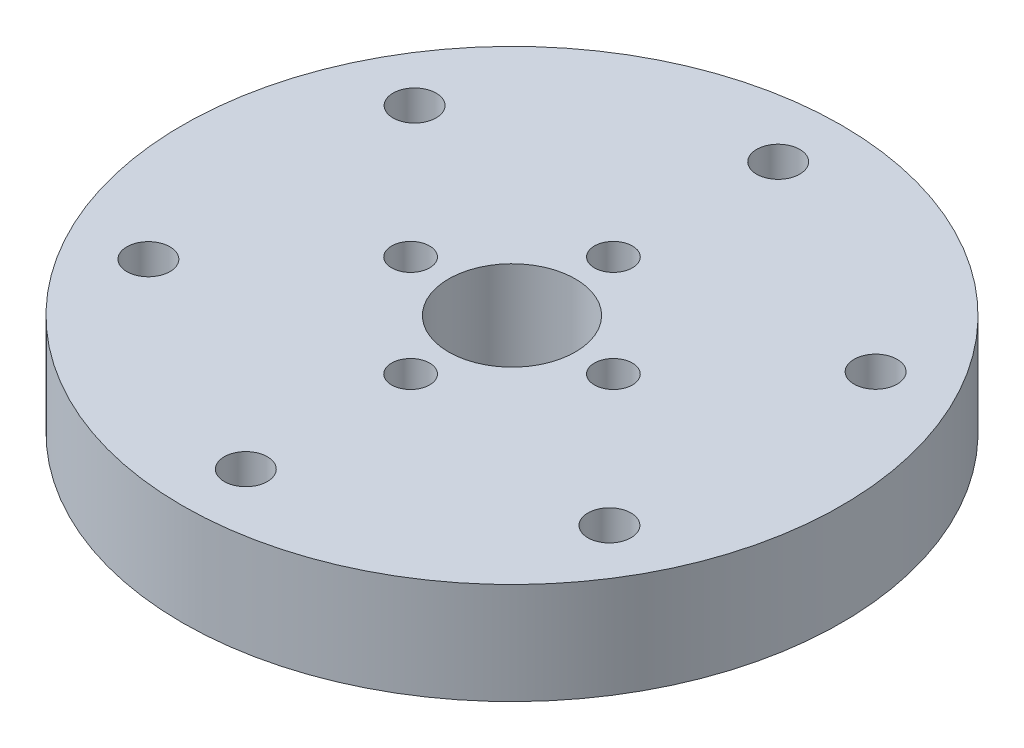
ISO-10303-21;
HEADER;
FILE_DESCRIPTION(('STEP AP214'),'2;1');
FILE_NAME('part.step','',(''),(''),'','','');
FILE_SCHEMA(('AUTOMOTIVE_DESIGN { 1 0 10303 214 1 1 1 1 }'));
ENDSEC;
DATA;
#1=APPLICATION_CONTEXT('core data for automotive mechanical design processes');
#2=APPLICATION_PROTOCOL_DEFINITION('international standard','automotive_design',2000,#1);
#3=PRODUCT_CONTEXT('',#1,'mechanical');
#4=PRODUCT('Part','Part','',(#3));
#5=PRODUCT_RELATED_PRODUCT_CATEGORY('part','',(#4));
#6=PRODUCT_DEFINITION_FORMATION('','',#4);
#7=PRODUCT_DEFINITION_CONTEXT('part definition',#1,'design');
#8=PRODUCT_DEFINITION('design','',#6,#7);
#9=PRODUCT_DEFINITION_SHAPE('','',#8);
#10=(LENGTH_UNIT() NAMED_UNIT(*) SI_UNIT(.MILLI.,.METRE.));
#11=(NAMED_UNIT(*) PLANE_ANGLE_UNIT() SI_UNIT($,.RADIAN.));
#12=(NAMED_UNIT(*) SI_UNIT($,.STERADIAN.) SOLID_ANGLE_UNIT());
#13=UNCERTAINTY_MEASURE_WITH_UNIT(LENGTH_MEASURE(1.E-05),#10,'distance_accuracy_value','');
#14=(GEOMETRIC_REPRESENTATION_CONTEXT(3) GLOBAL_UNCERTAINTY_ASSIGNED_CONTEXT((#13)) GLOBAL_UNIT_ASSIGNED_CONTEXT((#10,
#11,#12)) REPRESENTATION_CONTEXT('',''));
#15=CARTESIAN_POINT('',(0.,0.,0.));
#16=DIRECTION('',(0.,0.,1.));
#17=DIRECTION('',(1.,0.,0.));
#18=AXIS2_PLACEMENT_3D('',#15,#16,#17);
#19=CARTESIAN_POINT('',(0.,0.,0.));
#20=DIRECTION('',(0.,1.,0.));
#21=DIRECTION('',(0.,0.,1.));
#22=AXIS2_PLACEMENT_3D('',#19,#20,#21);
#23=PLANE('',#22);
#24=CARTESIAN_POINT('',(-18.1865334794731,0.,-10.5000000000002));
#25=DIRECTION('',(0.,1.,0.));
#26=DIRECTION('',(0.,0.,1.));
#27=AXIS2_PLACEMENT_3D('',#24,#25,#26);
#28=CIRCLE('',#27,1.7);
#29=CARTESIAN_POINT('',(-18.1865334794731,0.,-8.80000000000021));
#30=VERTEX_POINT('',#29);
#31=EDGE_CURVE('E121',#30,#30,#28,.T.);
#32=ORIENTED_EDGE('',*,*,#31,.T.);
#33=EDGE_LOOP('',(#32));
#34=FACE_BOUND('',#33,.T.);
#35=CARTESIAN_POINT('',(-18.1865334794731,0.,-10.5000000000002));
#36=DIRECTION('',(0.,1.,0.));
#37=DIRECTION('',(0.,0.,1.));
#38=AXIS2_PLACEMENT_3D('',#35,#36,#37);
#39=CIRCLE('',#38,3.25);
#40=CARTESIAN_POINT('',(-18.1865334794731,0.,-7.25000000000021));
#41=VERTEX_POINT('',#40);
#42=EDGE_CURVE('E11',#41,#41,#39,.T.);
#43=ORIENTED_EDGE('',*,*,#42,.F.);
#44=EDGE_LOOP('',(#43));
#45=FACE_BOUND('',#44,.T.);
#46=ADVANCED_FACE('F79',(#34,#45),#23,.F.);
#47=CARTESIAN_POINT('',(-18.1865334794733,0.,10.4999999999998));
#48=DIRECTION('',(0.,1.,0.));
#49=DIRECTION('',(0.,0.,1.));
#50=AXIS2_PLACEMENT_3D('',#47,#48,#49);
#51=CIRCLE('',#50,1.7);
#52=CARTESIAN_POINT('',(-18.1865334794733,0.,12.1999999999998));
#53=VERTEX_POINT('',#52);
#54=EDGE_CURVE('E165',#53,#53,#51,.T.);
#55=ORIENTED_EDGE('',*,*,#54,.T.);
#56=EDGE_LOOP('',(#55));
#57=FACE_BOUND('',#56,.T.);
#58=CARTESIAN_POINT('',(-18.1865334794733,0.,10.4999999999998));
#59=DIRECTION('',(0.,1.,0.));
#60=DIRECTION('',(0.,0.,1.));
#61=AXIS2_PLACEMENT_3D('',#58,#59,#60);
#62=CIRCLE('',#61,3.25);
#63=CARTESIAN_POINT('',(-18.1865334794733,0.,13.7499999999998));
#64=VERTEX_POINT('',#63);
#65=EDGE_CURVE('E88',#64,#64,#62,.T.);
#66=ORIENTED_EDGE('',*,*,#65,.F.);
#67=EDGE_LOOP('',(#66));
#68=FACE_BOUND('',#67,.T.);
#69=ADVANCED_FACE('F255',(#57,#68),#23,.F.);
#70=CARTESIAN_POINT('',(-1.46642216231412E-13,0.,21.));
#71=DIRECTION('',(0.,1.,0.));
#72=DIRECTION('',(0.,0.,1.));
#73=AXIS2_PLACEMENT_3D('',#70,#71,#72);
#74=CIRCLE('',#73,1.7);
#75=CARTESIAN_POINT('',(-1.46642216231412E-13,0.,22.7));
#76=VERTEX_POINT('',#75);
#77=EDGE_CURVE('E160',#76,#76,#74,.T.);
#78=ORIENTED_EDGE('',*,*,#77,.T.);
#79=EDGE_LOOP('',(#78));
#80=FACE_BOUND('',#79,.T.);
#81=CARTESIAN_POINT('',(-1.46642216231412E-13,0.,21.));
#82=DIRECTION('',(0.,1.,0.));
#83=DIRECTION('',(0.,0.,1.));
#84=AXIS2_PLACEMENT_3D('',#81,#82,#83);
#85=CIRCLE('',#84,3.25);
#86=CARTESIAN_POINT('',(-1.46642216231412E-13,0.,24.25));
#87=VERTEX_POINT('',#86);
#88=EDGE_CURVE('E94',#87,#87,#85,.T.);
#89=ORIENTED_EDGE('',*,*,#88,.F.);
#90=EDGE_LOOP('',(#89));
#91=FACE_BOUND('',#90,.T.);
#92=ADVANCED_FACE('F263',(#80,#91),#23,.F.);
#93=CARTESIAN_POINT('',(18.1865334794732,0.,10.5000000000001));
#94=DIRECTION('',(0.,1.,0.));
#95=DIRECTION('',(0.,0.,1.));
#96=AXIS2_PLACEMENT_3D('',#93,#94,#95);
#97=CIRCLE('',#96,1.7);
#98=CARTESIAN_POINT('',(18.1865334794732,0.,12.2000000000001));
#99=VERTEX_POINT('',#98);
#100=EDGE_CURVE('E156',#99,#99,#97,.T.);
#101=ORIENTED_EDGE('',*,*,#100,.T.);
#102=EDGE_LOOP('',(#101));
#103=FACE_BOUND('',#102,.T.);
#104=CARTESIAN_POINT('',(18.1865334794732,0.,10.5000000000001));
#105=DIRECTION('',(0.,1.,0.));
#106=DIRECTION('',(0.,0.,1.));
#107=AXIS2_PLACEMENT_3D('',#104,#105,#106);
#108=CIRCLE('',#107,3.25);
#109=CARTESIAN_POINT('',(18.1865334794732,0.,13.7500000000001));
#110=VERTEX_POINT('',#109);
#111=EDGE_CURVE('E103',#110,#110,#108,.T.);
#112=ORIENTED_EDGE('',*,*,#111,.F.);
#113=EDGE_LOOP('',(#112));
#114=FACE_BOUND('',#113,.T.);
#115=ADVANCED_FACE('F277',(#103,#114),#23,.F.);
#116=CARTESIAN_POINT('',(18.1865334794732,0.,-10.5));
#117=DIRECTION('',(0.,1.,0.));
#118=DIRECTION('',(0.,0.,1.));
#119=AXIS2_PLACEMENT_3D('',#116,#117,#118);
#120=CIRCLE('',#119,1.7);
#121=CARTESIAN_POINT('',(18.1865334794732,0.,-8.79999999999995));
#122=VERTEX_POINT('',#121);
#123=EDGE_CURVE('E175',#122,#122,#120,.T.);
#124=ORIENTED_EDGE('',*,*,#123,.T.);
#125=EDGE_LOOP('',(#124));
#126=FACE_BOUND('',#125,.T.);
#127=CARTESIAN_POINT('',(18.1865334794732,0.,-10.5));
#128=DIRECTION('',(0.,1.,0.));
#129=DIRECTION('',(0.,0.,1.));
#130=AXIS2_PLACEMENT_3D('',#127,#128,#129);
#131=CIRCLE('',#130,3.25);
#132=CARTESIAN_POINT('',(18.1865334794732,0.,-7.24999999999995));
#133=VERTEX_POINT('',#132);
#134=EDGE_CURVE('E107',#133,#133,#131,.T.);
#135=ORIENTED_EDGE('',*,*,#134,.F.);
#136=EDGE_LOOP('',(#135));
#137=FACE_BOUND('',#136,.T.);
#138=ADVANCED_FACE('F269',(#126,#137),#23,.F.);
#139=CARTESIAN_POINT('',(0.,0.,-21.));
#140=DIRECTION('',(0.,1.,0.));
#141=DIRECTION('',(0.,0.,1.));
#142=AXIS2_PLACEMENT_3D('',#139,#140,#141);
#143=CIRCLE('',#142,1.7);
#144=CARTESIAN_POINT('',(0.,0.,-19.3));
#145=VERTEX_POINT('',#144);
#146=EDGE_CURVE('E83',#145,#145,#143,.T.);
#147=ORIENTED_EDGE('',*,*,#146,.T.);
#148=EDGE_LOOP('',(#147));
#149=FACE_BOUND('',#148,.T.);
#150=CARTESIAN_POINT('',(0.,0.,-21.));
#151=DIRECTION('',(0.,1.,0.));
#152=DIRECTION('',(0.,0.,1.));
#153=AXIS2_PLACEMENT_3D('',#150,#151,#152);
#154=CIRCLE('',#153,3.25);
#155=CARTESIAN_POINT('',(0.,0.,-17.75));
#156=VERTEX_POINT('',#155);
#157=EDGE_CURVE('E111',#156,#156,#154,.T.);
#158=ORIENTED_EDGE('',*,*,#157,.F.);
#159=EDGE_LOOP('',(#158));
#160=FACE_BOUND('',#159,.T.);
#161=ADVANCED_FACE('F258',(#149,#160),#23,.F.);
#162=CARTESIAN_POINT('',(-18.1865334794731,4.7,-10.5000000000002));
#163=DIRECTION('',(0.,-1.,0.));
#164=DIRECTION('',(0.,0.,-1.));
#165=AXIS2_PLACEMENT_3D('',#162,#163,#164);
#166=CYLINDRICAL_SURFACE('',#165,1.7);
#167=CARTESIAN_POINT('',(-18.1865334794731,4.7,-10.5000000000002));
#168=DIRECTION('',(0.,1.,0.));
#169=DIRECTION('',(0.,0.,1.));
#170=AXIS2_PLACEMENT_3D('',#167,#168,#169);
#171=CIRCLE('',#170,1.7);
#172=CARTESIAN_POINT('',(-18.1865334794731,4.7,-8.80000000000021));
#173=VERTEX_POINT('',#172);
#174=EDGE_CURVE('E115',#173,#173,#171,.T.);
#175=ORIENTED_EDGE('',*,*,#174,.T.);
#176=EDGE_LOOP('',(#175));
#177=FACE_BOUND('',#176,.T.);
#178=ORIENTED_EDGE('',*,*,#31,.F.);
#179=EDGE_LOOP('',(#178));
#180=FACE_BOUND('',#179,.T.);
#181=ADVANCED_FACE('F268',(#177,#180),#166,.F.);
#182=CARTESIAN_POINT('',(-18.1865334794733,4.7,10.4999999999998));
#183=DIRECTION('',(0.,-1.,0.));
#184=DIRECTION('',(0.,0.,-1.));
#185=AXIS2_PLACEMENT_3D('',#182,#183,#184);
#186=CYLINDRICAL_SURFACE('',#185,1.7);
#187=CARTESIAN_POINT('',(-18.1865334794733,4.7,10.4999999999998));
#188=DIRECTION('',(0.,1.,0.));
#189=DIRECTION('',(0.,0.,1.));
#190=AXIS2_PLACEMENT_3D('',#187,#188,#189);
#191=CIRCLE('',#190,1.7);
#192=CARTESIAN_POINT('',(-18.1865334794733,4.7,12.1999999999998));
#193=VERTEX_POINT('',#192);
#194=EDGE_CURVE('E149',#193,#193,#191,.T.);
#195=ORIENTED_EDGE('',*,*,#194,.T.);
#196=EDGE_LOOP('',(#195));
#197=FACE_BOUND('',#196,.T.);
#198=ORIENTED_EDGE('',*,*,#54,.F.);
#199=EDGE_LOOP('',(#198));
#200=FACE_BOUND('',#199,.T.);
#201=ADVANCED_FACE('F275',(#197,#200),#186,.F.);
#202=CARTESIAN_POINT('',(-1.46642216231412E-13,4.7,21.));
#203=DIRECTION('',(0.,-1.,0.));
#204=DIRECTION('',(0.,0.,-1.));
#205=AXIS2_PLACEMENT_3D('',#202,#203,#204);
#206=CYLINDRICAL_SURFACE('',#205,1.7);
#207=CARTESIAN_POINT('',(-1.46642216231412E-13,4.7,21.));
#208=DIRECTION('',(0.,1.,0.));
#209=DIRECTION('',(0.,0.,1.));
#210=AXIS2_PLACEMENT_3D('',#207,#208,#209);
#211=CIRCLE('',#210,1.7);
#212=CARTESIAN_POINT('',(-1.46642216231412E-13,4.7,22.7));
#213=VERTEX_POINT('',#212);
#214=EDGE_CURVE('E145',#213,#213,#211,.T.);
#215=ORIENTED_EDGE('',*,*,#214,.T.);
#216=EDGE_LOOP('',(#215));
#217=FACE_BOUND('',#216,.T.);
#218=ORIENTED_EDGE('',*,*,#77,.F.);
#219=EDGE_LOOP('',(#218));
#220=FACE_BOUND('',#219,.T.);
#221=ADVANCED_FACE('F317',(#217,#220),#206,.F.);
#222=CARTESIAN_POINT('',(18.1865334794732,4.7,10.5000000000001));
#223=DIRECTION('',(0.,-1.,0.));
#224=DIRECTION('',(0.,0.,-1.));
#225=AXIS2_PLACEMENT_3D('',#222,#223,#224);
#226=CYLINDRICAL_SURFACE('',#225,1.7);
#227=CARTESIAN_POINT('',(18.1865334794732,4.7,10.5000000000001));
#228=DIRECTION('',(0.,1.,0.));
#229=DIRECTION('',(0.,0.,1.));
#230=AXIS2_PLACEMENT_3D('',#227,#228,#229);
#231=CIRCLE('',#230,1.7);
#232=CARTESIAN_POINT('',(18.1865334794732,4.7,12.2000000000001));
#233=VERTEX_POINT('',#232);
#234=EDGE_CURVE('E141',#233,#233,#231,.T.);
#235=ORIENTED_EDGE('',*,*,#234,.T.);
#236=EDGE_LOOP('',(#235));
#237=FACE_BOUND('',#236,.T.);
#238=ORIENTED_EDGE('',*,*,#100,.F.);
#239=EDGE_LOOP('',(#238));
#240=FACE_BOUND('',#239,.T.);
#241=ADVANCED_FACE('F319',(#237,#240),#226,.F.);
#242=CARTESIAN_POINT('',(0.,4.7,0.));
#243=DIRECTION('',(0.,-1.,0.));
#244=DIRECTION('',(0.,0.,-1.));
#245=AXIS2_PLACEMENT_3D('',#242,#243,#244);
#246=CYLINDRICAL_SURFACE('',#245,26.);
#247=CARTESIAN_POINT('',(0.,4.7,0.));
#248=DIRECTION('',(0.,1.,0.));
#249=DIRECTION('',(0.,0.,1.));
#250=AXIS2_PLACEMENT_3D('',#247,#248,#249);
#251=CIRCLE('',#250,26.);
#252=CARTESIAN_POINT('',(0.,4.7,26.));
#253=VERTEX_POINT('',#252);
#254=EDGE_CURVE('E137',#253,#253,#251,.T.);
#255=ORIENTED_EDGE('',*,*,#254,.F.);
#256=EDGE_LOOP('',(#255));
#257=FACE_BOUND('',#256,.T.);
#258=CARTESIAN_POINT('',(0.,-3.3,0.));
#259=DIRECTION('',(0.,1.,0.));
#260=DIRECTION('',(0.,0.,1.));
#261=AXIS2_PLACEMENT_3D('',#258,#259,#260);
#262=CIRCLE('',#261,26.);
#263=CARTESIAN_POINT('',(0.,-3.3,26.));
#264=VERTEX_POINT('',#263);
#265=EDGE_CURVE('E97',#264,#264,#262,.T.);
#266=ORIENTED_EDGE('',*,*,#265,.T.);
#267=EDGE_LOOP('',(#266));
#268=FACE_BOUND('',#267,.T.);
#269=ADVANCED_FACE('F326',(#257,#268),#246,.T.);
#270=CARTESIAN_POINT('',(0.,4.7,0.));
#271=DIRECTION('',(0.,-1.,0.));
#272=DIRECTION('',(0.,0.,-1.));
#273=AXIS2_PLACEMENT_3D('',#270,#271,#272);
#274=CYLINDRICAL_SURFACE('',#273,5.);
#275=CARTESIAN_POINT('',(0.,4.7,0.));
#276=DIRECTION('',(0.,1.,0.));
#277=DIRECTION('',(0.,0.,1.));
#278=AXIS2_PLACEMENT_3D('',#275,#276,#277);
#279=CIRCLE('',#278,5.);
#280=CARTESIAN_POINT('',(0.,4.7,5.));
#281=VERTEX_POINT('',#280);
#282=EDGE_CURVE('E133',#281,#281,#279,.T.);
#283=ORIENTED_EDGE('',*,*,#282,.T.);
#284=EDGE_LOOP('',(#283));
#285=FACE_BOUND('',#284,.T.);
#286=CARTESIAN_POINT('',(0.,-3.3,0.));
#287=DIRECTION('',(0.,1.,0.));
#288=DIRECTION('',(0.,0.,1.));
#289=AXIS2_PLACEMENT_3D('',#286,#287,#288);
#290=CIRCLE('',#289,5.);
#291=CARTESIAN_POINT('',(0.,-3.3,5.));
#292=VERTEX_POINT('',#291);
#293=EDGE_CURVE('E189',#292,#292,#290,.T.);
#294=ORIENTED_EDGE('',*,*,#293,.F.);
#295=EDGE_LOOP('',(#294));
#296=FACE_BOUND('',#295,.T.);
#297=ADVANCED_FACE('F333',(#285,#296),#274,.F.);
#298=CARTESIAN_POINT('',(0.,4.7,8.));
#299=DIRECTION('',(0.,-1.,0.));
#300=DIRECTION('',(0.,0.,-1.));
#301=AXIS2_PLACEMENT_3D('',#298,#299,#300);
#302=CYLINDRICAL_SURFACE('',#301,1.5);
#303=CARTESIAN_POINT('',(0.,4.7,8.));
#304=DIRECTION('',(0.,1.,0.));
#305=DIRECTION('',(0.,0.,1.));
#306=AXIS2_PLACEMENT_3D('',#303,#304,#305);
#307=CIRCLE('',#306,1.5);
#308=CARTESIAN_POINT('',(0.,4.7,9.5));
#309=VERTEX_POINT('',#308);
#310=EDGE_CURVE('E129',#309,#309,#307,.T.);
#311=ORIENTED_EDGE('',*,*,#310,.T.);
#312=EDGE_LOOP('',(#311));
#313=FACE_BOUND('',#312,.T.);
#314=CARTESIAN_POINT('',(0.,-3.3,8.));
#315=DIRECTION('',(0.,1.,0.));
#316=DIRECTION('',(0.,0.,1.));
#317=AXIS2_PLACEMENT_3D('',#314,#315,#316);
#318=CIRCLE('',#317,1.5);
#319=CARTESIAN_POINT('',(0.,-3.3,9.5));
#320=VERTEX_POINT('',#319);
#321=EDGE_CURVE('E194',#320,#320,#318,.T.);
#322=ORIENTED_EDGE('',*,*,#321,.F.);
#323=EDGE_LOOP('',(#322));
#324=FACE_BOUND('',#323,.T.);
#325=ADVANCED_FACE('F337',(#313,#324),#302,.F.);
#326=CARTESIAN_POINT('',(-8.,4.7,0.));
#327=DIRECTION('',(0.,-1.,0.));
#328=DIRECTION('',(0.,0.,-1.));
#329=AXIS2_PLACEMENT_3D('',#326,#327,#328);
#330=CYLINDRICAL_SURFACE('',#329,1.5);
#331=CARTESIAN_POINT('',(-8.,4.7,0.));
#332=DIRECTION('',(0.,1.,0.));
#333=DIRECTION('',(0.,0.,1.));
#334=AXIS2_PLACEMENT_3D('',#331,#332,#333);
#335=CIRCLE('',#334,1.5);
#336=CARTESIAN_POINT('',(-8.,4.7,1.49999999999997));
#337=VERTEX_POINT('',#336);
#338=EDGE_CURVE('E125',#337,#337,#335,.T.);
#339=ORIENTED_EDGE('',*,*,#338,.T.);
#340=EDGE_LOOP('',(#339));
#341=FACE_BOUND('',#340,.T.);
#342=CARTESIAN_POINT('',(-8.,-3.3,0.));
#343=DIRECTION('',(0.,1.,0.));
#344=DIRECTION('',(0.,0.,1.));
#345=AXIS2_PLACEMENT_3D('',#342,#343,#344);
#346=CIRCLE('',#345,1.5);
#347=CARTESIAN_POINT('',(-8.,-3.3,1.49999999999997));
#348=VERTEX_POINT('',#347);
#349=EDGE_CURVE('E199',#348,#348,#346,.T.);
#350=ORIENTED_EDGE('',*,*,#349,.F.);
#351=EDGE_LOOP('',(#350));
#352=FACE_BOUND('',#351,.T.);
#353=ADVANCED_FACE('F341',(#341,#352),#330,.F.);
#354=CARTESIAN_POINT('',(0.,4.7,-8.));
#355=DIRECTION('',(0.,-1.,0.));
#356=DIRECTION('',(0.,0.,-1.));
#357=AXIS2_PLACEMENT_3D('',#354,#355,#356);
#358=CYLINDRICAL_SURFACE('',#357,1.5);
#359=CARTESIAN_POINT('',(0.,4.7,-8.));
#360=DIRECTION('',(0.,1.,0.));
#361=DIRECTION('',(0.,0.,1.));
#362=AXIS2_PLACEMENT_3D('',#359,#360,#361);
#363=CIRCLE('',#362,1.5);
#364=CARTESIAN_POINT('',(0.,4.7,-6.5));
#365=VERTEX_POINT('',#364);
#366=EDGE_CURVE('E120',#365,#365,#363,.T.);
#367=ORIENTED_EDGE('',*,*,#366,.T.);
#368=EDGE_LOOP('',(#367));
#369=FACE_BOUND('',#368,.T.);
#370=CARTESIAN_POINT('',(0.,-3.3,-8.));
#371=DIRECTION('',(0.,1.,0.));
#372=DIRECTION('',(0.,0.,1.));
#373=AXIS2_PLACEMENT_3D('',#370,#371,#372);
#374=CIRCLE('',#373,1.5);
#375=CARTESIAN_POINT('',(0.,-3.3,-6.5));
#376=VERTEX_POINT('',#375);
#377=EDGE_CURVE('E205',#376,#376,#374,.T.);
#378=ORIENTED_EDGE('',*,*,#377,.F.);
#379=EDGE_LOOP('',(#378));
#380=FACE_BOUND('',#379,.T.);
#381=ADVANCED_FACE('F345',(#369,#380),#358,.F.);
#382=CARTESIAN_POINT('',(8.,4.7,0.));
#383=DIRECTION('',(0.,-1.,0.));
#384=DIRECTION('',(0.,0.,-1.));
#385=AXIS2_PLACEMENT_3D('',#382,#383,#384);
#386=CYLINDRICAL_SURFACE('',#385,1.5);
#387=CARTESIAN_POINT('',(8.,4.7,0.));
#388=DIRECTION('',(0.,1.,0.));
#389=DIRECTION('',(0.,0.,1.));
#390=AXIS2_PLACEMENT_3D('',#387,#388,#389);
#391=CIRCLE('',#390,1.5);
#392=CARTESIAN_POINT('',(8.,4.7,1.50000000000009));
#393=VERTEX_POINT('',#392);
#394=EDGE_CURVE('E116',#393,#393,#391,.T.);
#395=ORIENTED_EDGE('',*,*,#394,.T.);
#396=EDGE_LOOP('',(#395));
#397=FACE_BOUND('',#396,.T.);
#398=CARTESIAN_POINT('',(8.,-3.3,0.));
#399=DIRECTION('',(0.,1.,0.));
#400=DIRECTION('',(0.,0.,1.));
#401=AXIS2_PLACEMENT_3D('',#398,#399,#400);
#402=CIRCLE('',#401,1.5);
#403=CARTESIAN_POINT('',(8.,-3.3,1.50000000000009));
#404=VERTEX_POINT('',#403);
#405=EDGE_CURVE('E209',#404,#404,#402,.T.);
#406=ORIENTED_EDGE('',*,*,#405,.F.);
#407=EDGE_LOOP('',(#406));
#408=FACE_BOUND('',#407,.T.);
#409=ADVANCED_FACE('F349',(#397,#408),#386,.F.);
#410=CARTESIAN_POINT('',(0.,4.7,0.));
#411=DIRECTION('',(0.,1.,0.));
#412=DIRECTION('',(0.,0.,1.));
#413=AXIS2_PLACEMENT_3D('',#410,#411,#412);
#414=PLANE('',#413);
#415=ORIENTED_EDGE('',*,*,#394,.F.);
#416=EDGE_LOOP('',(#415));
#417=FACE_BOUND('',#416,.T.);
#418=ORIENTED_EDGE('',*,*,#366,.F.);
#419=EDGE_LOOP('',(#418));
#420=FACE_BOUND('',#419,.T.);
#421=ORIENTED_EDGE('',*,*,#338,.F.);
#422=EDGE_LOOP('',(#421));
#423=FACE_BOUND('',#422,.T.);
#424=ORIENTED_EDGE('',*,*,#310,.F.);
#425=EDGE_LOOP('',(#424));
#426=FACE_BOUND('',#425,.T.);
#427=ORIENTED_EDGE('',*,*,#282,.F.);
#428=EDGE_LOOP('',(#427));
#429=FACE_BOUND('',#428,.T.);
#430=ORIENTED_EDGE('',*,*,#254,.T.);
#431=EDGE_LOOP('',(#430));
#432=FACE_BOUND('',#431,.T.);
#433=ORIENTED_EDGE('',*,*,#234,.F.);
#434=EDGE_LOOP('',(#433));
#435=FACE_BOUND('',#434,.T.);
#436=ORIENTED_EDGE('',*,*,#214,.F.);
#437=EDGE_LOOP('',(#436));
#438=FACE_BOUND('',#437,.T.);
#439=ORIENTED_EDGE('',*,*,#194,.F.);
#440=EDGE_LOOP('',(#439));
#441=FACE_BOUND('',#440,.T.);
#442=ORIENTED_EDGE('',*,*,#174,.F.);
#443=EDGE_LOOP('',(#442));
#444=FACE_BOUND('',#443,.T.);
#445=CARTESIAN_POINT('',(0.,4.7,-21.));
#446=DIRECTION('',(0.,1.,0.));
#447=DIRECTION('',(0.,0.,1.));
#448=AXIS2_PLACEMENT_3D('',#445,#446,#447);
#449=CIRCLE('',#448,1.7);
#450=CARTESIAN_POINT('',(0.,4.7,-19.3));
#451=VERTEX_POINT('',#450);
#452=EDGE_CURVE('E178',#451,#451,#449,.T.);
#453=ORIENTED_EDGE('',*,*,#452,.F.);
#454=EDGE_LOOP('',(#453));
#455=FACE_BOUND('',#454,.T.);
#456=CARTESIAN_POINT('',(18.1865334794732,4.7,-10.5));
#457=DIRECTION('',(0.,1.,0.));
#458=DIRECTION('',(0.,0.,1.));
#459=AXIS2_PLACEMENT_3D('',#456,#457,#458);
#460=CIRCLE('',#459,1.7);
#461=CARTESIAN_POINT('',(18.1865334794732,4.7,-8.79999999999995));
#462=VERTEX_POINT('',#461);
#463=EDGE_CURVE('E161',#462,#462,#460,.T.);
#464=ORIENTED_EDGE('',*,*,#463,.F.);
#465=EDGE_LOOP('',(#464));
#466=FACE_BOUND('',#465,.T.);
#467=ADVANCED_FACE('F351',(#417,#420,#423,#426,#429,#432,#435,#438,#441,#444,#455,#466),#414,.T.);
#468=CARTESIAN_POINT('',(0.,4.7,-21.));
#469=DIRECTION('',(0.,-1.,0.));
#470=DIRECTION('',(0.,0.,-1.));
#471=AXIS2_PLACEMENT_3D('',#468,#469,#470);
#472=CYLINDRICAL_SURFACE('',#471,1.7);
#473=ORIENTED_EDGE('',*,*,#452,.T.);
#474=EDGE_LOOP('',(#473));
#475=FACE_BOUND('',#474,.T.);
#476=ORIENTED_EDGE('',*,*,#146,.F.);
#477=EDGE_LOOP('',(#476));
#478=FACE_BOUND('',#477,.T.);
#479=ADVANCED_FACE('F81',(#475,#478),#472,.F.);
#480=CARTESIAN_POINT('',(18.1865334794732,4.7,-10.5));
#481=DIRECTION('',(0.,-1.,0.));
#482=DIRECTION('',(0.,0.,-1.));
#483=AXIS2_PLACEMENT_3D('',#480,#481,#482);
#484=CYLINDRICAL_SURFACE('',#483,1.7);
#485=ORIENTED_EDGE('',*,*,#463,.T.);
#486=EDGE_LOOP('',(#485));
#487=FACE_BOUND('',#486,.T.);
#488=ORIENTED_EDGE('',*,*,#123,.F.);
#489=EDGE_LOOP('',(#488));
#490=FACE_BOUND('',#489,.T.);
#491=ADVANCED_FACE('F285',(#487,#490),#484,.F.);
#492=CARTESIAN_POINT('',(0.,-3.3,-21.));
#493=DIRECTION('',(0.,1.,0.));
#494=DIRECTION('',(0.,0.,1.));
#495=AXIS2_PLACEMENT_3D('',#492,#493,#494);
#496=CYLINDRICAL_SURFACE('',#495,3.25);
#497=CARTESIAN_POINT('',(0.,-3.3,-21.));
#498=DIRECTION('',(0.,1.,0.));
#499=DIRECTION('',(0.,0.,1.));
#500=AXIS2_PLACEMENT_3D('',#497,#498,#499);
#501=CIRCLE('',#500,3.25);
#502=CARTESIAN_POINT('',(0.,-3.3,-17.75));
#503=VERTEX_POINT('',#502);
#504=EDGE_CURVE('E213',#503,#503,#501,.T.);
#505=ORIENTED_EDGE('',*,*,#504,.F.);
#506=EDGE_LOOP('',(#505));
#507=FACE_BOUND('',#506,.T.);
#508=ORIENTED_EDGE('',*,*,#157,.T.);
#509=EDGE_LOOP('',(#508));
#510=FACE_BOUND('',#509,.T.);
#511=ADVANCED_FACE('F282',(#507,#510),#496,.F.);
#512=CARTESIAN_POINT('',(18.1865334794732,-3.3,-10.5));
#513=DIRECTION('',(0.,1.,0.));
#514=DIRECTION('',(0.,0.,1.));
#515=AXIS2_PLACEMENT_3D('',#512,#513,#514);
#516=CYLINDRICAL_SURFACE('',#515,3.25);
#517=CARTESIAN_POINT('',(18.1865334794732,-3.3,-10.5));
#518=DIRECTION('',(0.,1.,0.));
#519=DIRECTION('',(0.,0.,1.));
#520=AXIS2_PLACEMENT_3D('',#517,#518,#519);
#521=CIRCLE('',#520,3.25);
#522=CARTESIAN_POINT('',(18.1865334794732,-3.3,-7.24999999999995));
#523=VERTEX_POINT('',#522);
#524=EDGE_CURVE('E217',#523,#523,#521,.T.);
#525=ORIENTED_EDGE('',*,*,#524,.F.);
#526=EDGE_LOOP('',(#525));
#527=FACE_BOUND('',#526,.T.);
#528=ORIENTED_EDGE('',*,*,#134,.T.);
#529=EDGE_LOOP('',(#528));
#530=FACE_BOUND('',#529,.T.);
#531=ADVANCED_FACE('F284',(#527,#530),#516,.F.);
#532=CARTESIAN_POINT('',(18.1865334794732,-3.3,10.5000000000001));
#533=DIRECTION('',(0.,1.,0.));
#534=DIRECTION('',(0.,0.,1.));
#535=AXIS2_PLACEMENT_3D('',#532,#533,#534);
#536=CYLINDRICAL_SURFACE('',#535,3.25);
#537=CARTESIAN_POINT('',(18.1865334794732,-3.3,10.5000000000001));
#538=DIRECTION('',(0.,1.,0.));
#539=DIRECTION('',(0.,0.,1.));
#540=AXIS2_PLACEMENT_3D('',#537,#538,#539);
#541=CIRCLE('',#540,3.25);
#542=CARTESIAN_POINT('',(18.1865334794732,-3.3,13.7500000000001));
#543=VERTEX_POINT('',#542);
#544=EDGE_CURVE('E221',#543,#543,#541,.T.);
#545=ORIENTED_EDGE('',*,*,#544,.F.);
#546=EDGE_LOOP('',(#545));
#547=FACE_BOUND('',#546,.T.);
#548=ORIENTED_EDGE('',*,*,#111,.T.);
#549=EDGE_LOOP('',(#548));
#550=FACE_BOUND('',#549,.T.);
#551=ADVANCED_FACE('F292',(#547,#550),#536,.F.);
#552=CARTESIAN_POINT('',(-1.46642216231412E-13,-3.3,21.));
#553=DIRECTION('',(0.,1.,0.));
#554=DIRECTION('',(0.,0.,1.));
#555=AXIS2_PLACEMENT_3D('',#552,#553,#554);
#556=CYLINDRICAL_SURFACE('',#555,3.25);
#557=CARTESIAN_POINT('',(-1.46642216231412E-13,-3.3,21.));
#558=DIRECTION('',(0.,1.,0.));
#559=DIRECTION('',(0.,0.,1.));
#560=AXIS2_PLACEMENT_3D('',#557,#558,#559);
#561=CIRCLE('',#560,3.25);
#562=CARTESIAN_POINT('',(-1.46642216231412E-13,-3.3,24.25));
#563=VERTEX_POINT('',#562);
#564=EDGE_CURVE('E225',#563,#563,#561,.T.);
#565=ORIENTED_EDGE('',*,*,#564,.F.);
#566=EDGE_LOOP('',(#565));
#567=FACE_BOUND('',#566,.T.);
#568=ORIENTED_EDGE('',*,*,#88,.T.);
#569=EDGE_LOOP('',(#568));
#570=FACE_BOUND('',#569,.T.);
#571=ADVANCED_FACE('F250',(#567,#570),#556,.F.);
#572=CARTESIAN_POINT('',(-18.1865334794733,-3.3,10.4999999999998));
#573=DIRECTION('',(0.,1.,0.));
#574=DIRECTION('',(0.,0.,1.));
#575=AXIS2_PLACEMENT_3D('',#572,#573,#574);
#576=CYLINDRICAL_SURFACE('',#575,3.25);
#577=CARTESIAN_POINT('',(-18.1865334794733,-3.3,10.4999999999998));
#578=DIRECTION('',(0.,1.,0.));
#579=DIRECTION('',(0.,0.,1.));
#580=AXIS2_PLACEMENT_3D('',#577,#578,#579);
#581=CIRCLE('',#580,3.25);
#582=CARTESIAN_POINT('',(-18.1865334794733,-3.3,13.7499999999998));
#583=VERTEX_POINT('',#582);
#584=EDGE_CURVE('E229',#583,#583,#581,.T.);
#585=ORIENTED_EDGE('',*,*,#584,.F.);
#586=EDGE_LOOP('',(#585));
#587=FACE_BOUND('',#586,.T.);
#588=ORIENTED_EDGE('',*,*,#65,.T.);
#589=EDGE_LOOP('',(#588));
#590=FACE_BOUND('',#589,.T.);
#591=ADVANCED_FACE('F243',(#587,#590),#576,.F.);
#592=CARTESIAN_POINT('',(-18.1865334794731,-3.3,-10.5000000000002));
#593=DIRECTION('',(0.,1.,0.));
#594=DIRECTION('',(0.,0.,1.));
#595=AXIS2_PLACEMENT_3D('',#592,#593,#594);
#596=CYLINDRICAL_SURFACE('',#595,3.25);
#597=CARTESIAN_POINT('',(-18.1865334794731,-3.3,-10.5000000000002));
#598=DIRECTION('',(0.,1.,0.));
#599=DIRECTION('',(0.,0.,1.));
#600=AXIS2_PLACEMENT_3D('',#597,#598,#599);
#601=CIRCLE('',#600,3.25);
#602=CARTESIAN_POINT('',(-18.1865334794731,-3.3,-7.25000000000021));
#603=VERTEX_POINT('',#602);
#604=EDGE_CURVE('E233',#603,#603,#601,.T.);
#605=ORIENTED_EDGE('',*,*,#604,.F.);
#606=EDGE_LOOP('',(#605));
#607=FACE_BOUND('',#606,.T.);
#608=ORIENTED_EDGE('',*,*,#42,.T.);
#609=EDGE_LOOP('',(#608));
#610=FACE_BOUND('',#609,.T.);
#611=ADVANCED_FACE('F241',(#607,#610),#596,.F.);
#612=CARTESIAN_POINT('',(0.,-3.3,0.));
#613=DIRECTION('',(0.,1.,0.));
#614=DIRECTION('',(0.,0.,1.));
#615=AXIS2_PLACEMENT_3D('',#612,#613,#614);
#616=PLANE('',#615);
#617=ORIENTED_EDGE('',*,*,#604,.T.);
#618=EDGE_LOOP('',(#617));
#619=FACE_BOUND('',#618,.T.);
#620=ORIENTED_EDGE('',*,*,#584,.T.);
#621=EDGE_LOOP('',(#620));
#622=FACE_BOUND('',#621,.T.);
#623=ORIENTED_EDGE('',*,*,#564,.T.);
#624=EDGE_LOOP('',(#623));
#625=FACE_BOUND('',#624,.T.);
#626=ORIENTED_EDGE('',*,*,#544,.T.);
#627=EDGE_LOOP('',(#626));
#628=FACE_BOUND('',#627,.T.);
#629=ORIENTED_EDGE('',*,*,#524,.T.);
#630=EDGE_LOOP('',(#629));
#631=FACE_BOUND('',#630,.T.);
#632=ORIENTED_EDGE('',*,*,#504,.T.);
#633=EDGE_LOOP('',(#632));
#634=FACE_BOUND('',#633,.T.);
#635=ORIENTED_EDGE('',*,*,#405,.T.);
#636=EDGE_LOOP('',(#635));
#637=FACE_BOUND('',#636,.T.);
#638=ORIENTED_EDGE('',*,*,#377,.T.);
#639=EDGE_LOOP('',(#638));
#640=FACE_BOUND('',#639,.T.);
#641=ORIENTED_EDGE('',*,*,#349,.T.);
#642=EDGE_LOOP('',(#641));
#643=FACE_BOUND('',#642,.T.);
#644=ORIENTED_EDGE('',*,*,#321,.T.);
#645=EDGE_LOOP('',(#644));
#646=FACE_BOUND('',#645,.T.);
#647=ORIENTED_EDGE('',*,*,#293,.T.);
#648=EDGE_LOOP('',(#647));
#649=FACE_BOUND('',#648,.T.);
#650=ORIENTED_EDGE('',*,*,#265,.F.);
#651=EDGE_LOOP('',(#650));
#652=FACE_BOUND('',#651,.T.);
#653=ADVANCED_FACE('F238',(#619,#622,#625,#628,#631,#634,#637,#640,#643,#646,#649,#652),#616,.F.);
#654=CLOSED_SHELL('',(#46,#69,#92,#115,#138,#161,#181,#201,#221,#241,#269,#297,#325,#353,#381,
#409,#467,#479,#491,#511,#531,#551,#571,#591,#611,#653));
#655=MANIFOLD_SOLID_BREP('B2',#654);
#656=ADVANCED_BREP_SHAPE_REPRESENTATION('',(#18,#655),#14);
#657=SHAPE_DEFINITION_REPRESENTATION(#9,#656);
ENDSEC;
END-ISO-10303-21;
